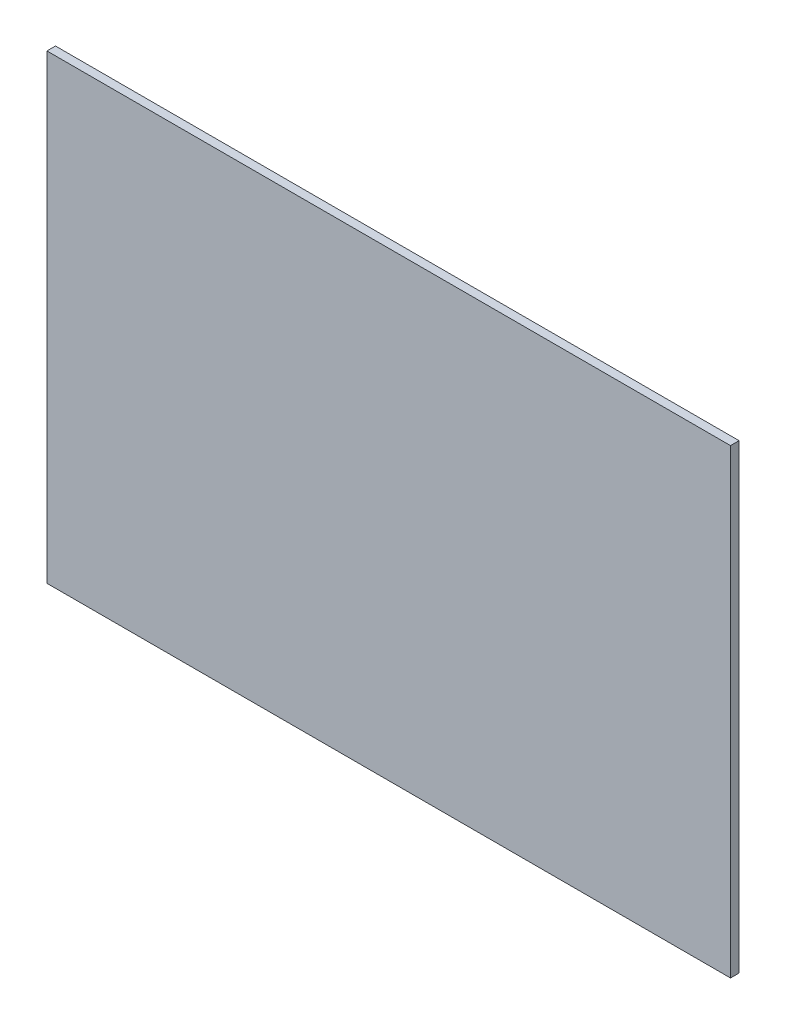
ISO-10303-21;
HEADER;
FILE_DESCRIPTION(('STEP AP214'),'2;1');
FILE_NAME('part.step','',(''),(''),'','','');
FILE_SCHEMA(('AUTOMOTIVE_DESIGN { 1 0 10303 214 1 1 1 1 }'));
ENDSEC;
DATA;
#1=APPLICATION_CONTEXT('core data for automotive mechanical design processes');
#2=APPLICATION_PROTOCOL_DEFINITION('international standard','automotive_design',2000,#1);
#3=PRODUCT_CONTEXT('',#1,'mechanical');
#4=PRODUCT('Part','Part','',(#3));
#5=PRODUCT_RELATED_PRODUCT_CATEGORY('part','',(#4));
#6=PRODUCT_DEFINITION_FORMATION('','',#4);
#7=PRODUCT_DEFINITION_CONTEXT('part definition',#1,'design');
#8=PRODUCT_DEFINITION('design','',#6,#7);
#9=PRODUCT_DEFINITION_SHAPE('','',#8);
#10=(LENGTH_UNIT() NAMED_UNIT(*) SI_UNIT(.MILLI.,.METRE.));
#11=(NAMED_UNIT(*) PLANE_ANGLE_UNIT() SI_UNIT($,.RADIAN.));
#12=(NAMED_UNIT(*) SI_UNIT($,.STERADIAN.) SOLID_ANGLE_UNIT());
#13=UNCERTAINTY_MEASURE_WITH_UNIT(LENGTH_MEASURE(1.E-05),#10,'distance_accuracy_value','');
#14=(GEOMETRIC_REPRESENTATION_CONTEXT(3) GLOBAL_UNCERTAINTY_ASSIGNED_CONTEXT((#13)) GLOBAL_UNIT_ASSIGNED_CONTEXT((#10,
#11,#12)) REPRESENTATION_CONTEXT('',''));
#15=CARTESIAN_POINT('',(0.,0.,0.));
#16=DIRECTION('',(0.,0.,1.));
#17=DIRECTION('',(1.,0.,0.));
#18=AXIS2_PLACEMENT_3D('',#15,#16,#17);
#19=CARTESIAN_POINT('',(460.816653826392,-310.816653826392,-988.461019240786));
#20=DIRECTION('',(0.,-1.,0.));
#21=DIRECTION('',(0.,0.,-1.));
#22=AXIS2_PLACEMENT_3D('',#19,#20,#21);
#23=PLANE('',#22);
#24=DIRECTION('',(-1.,0.,0.));
#25=VECTOR('',#24,1.);
#26=CARTESIAN_POINT('',(460.816653826392,-310.816653826392,-999.999));
#27=LINE('',#26,#25);
#28=CARTESIAN_POINT('',(460.816653826392,-310.816653826392,-999.999));
#29=VERTEX_POINT('',#28);
#30=CARTESIAN_POINT('',(-460.816653826392,-310.816653826392,-999.999));
#31=VERTEX_POINT('',#30);
#32=EDGE_CURVE('E79',#29,#31,#27,.T.);
#33=ORIENTED_EDGE('',*,*,#32,.F.);
#34=DIRECTION('',(0.,0.,-1.));
#35=VECTOR('',#34,1.);
#36=CARTESIAN_POINT('',(460.816653826392,-310.816653826392,-988.461019240786));
#37=LINE('',#36,#35);
#38=CARTESIAN_POINT('',(460.816653826392,-310.816653826392,-988.461019240786));
#39=VERTEX_POINT('',#38);
#40=EDGE_CURVE('E32',#39,#29,#37,.T.);
#41=ORIENTED_EDGE('',*,*,#40,.F.);
#42=DIRECTION('',(-1.,0.,0.));
#43=VECTOR('',#42,1.);
#44=CARTESIAN_POINT('',(460.816653826392,-310.816653826392,-988.461019240786));
#45=LINE('',#44,#43);
#46=CARTESIAN_POINT('',(-460.816653826392,-310.816653826392,-988.461019240786));
#47=VERTEX_POINT('',#46);
#48=EDGE_CURVE('E71',#39,#47,#45,.T.);
#49=ORIENTED_EDGE('',*,*,#48,.T.);
#50=DIRECTION('',(0.,0.,-1.));
#51=VECTOR('',#50,1.);
#52=CARTESIAN_POINT('',(-460.816653826392,-310.816653826392,-988.461019240786));
#53=LINE('',#52,#51);
#54=EDGE_CURVE('E10',#47,#31,#53,.T.);
#55=ORIENTED_EDGE('',*,*,#54,.T.);
#56=EDGE_LOOP('',(#33,#41,#49,#55));
#57=FACE_BOUND('',#56,.T.);
#58=ADVANCED_FACE('F16',(#57),#23,.T.);
#59=CARTESIAN_POINT('',(-460.816653826392,-310.816653826392,-988.461019240786));
#60=DIRECTION('',(-1.,0.,0.));
#61=DIRECTION('',(0.,-1.,0.));
#62=AXIS2_PLACEMENT_3D('',#59,#60,#61);
#63=PLANE('',#62);
#64=DIRECTION('',(0.,1.,0.));
#65=VECTOR('',#64,1.);
#66=CARTESIAN_POINT('',(-460.816653826392,-310.816653826392,-999.999));
#67=LINE('',#66,#65);
#68=CARTESIAN_POINT('',(-460.816653826392,310.816653826392,-999.999));
#69=VERTEX_POINT('',#68);
#70=EDGE_CURVE('E82',#31,#69,#67,.T.);
#71=ORIENTED_EDGE('',*,*,#70,.F.);
#72=ORIENTED_EDGE('',*,*,#54,.F.);
#73=DIRECTION('',(0.,1.,0.));
#74=VECTOR('',#73,1.);
#75=CARTESIAN_POINT('',(-460.816653826392,-310.816653826392,-988.461019240786));
#76=LINE('',#75,#74);
#77=CARTESIAN_POINT('',(-460.816653826392,310.816653826392,-988.461019240786));
#78=VERTEX_POINT('',#77);
#79=EDGE_CURVE('E67',#47,#78,#76,.T.);
#80=ORIENTED_EDGE('',*,*,#79,.T.);
#81=DIRECTION('',(0.,0.,-1.));
#82=VECTOR('',#81,1.);
#83=CARTESIAN_POINT('',(-460.816653826392,310.816653826392,-988.461019240786));
#84=LINE('',#83,#82);
#85=EDGE_CURVE('E24',#78,#69,#84,.T.);
#86=ORIENTED_EDGE('',*,*,#85,.T.);
#87=EDGE_LOOP('',(#71,#72,#80,#86));
#88=FACE_BOUND('',#87,.T.);
#89=ADVANCED_FACE('F68',(#88),#63,.T.);
#90=CARTESIAN_POINT('',(-460.816653826392,310.816653826392,-988.461019240786));
#91=DIRECTION('',(0.,1.,0.));
#92=DIRECTION('',(0.,0.,1.));
#93=AXIS2_PLACEMENT_3D('',#90,#91,#92);
#94=PLANE('',#93);
#95=DIRECTION('',(1.,0.,0.));
#96=VECTOR('',#95,1.);
#97=CARTESIAN_POINT('',(-460.816653826392,310.816653826392,-999.999));
#98=LINE('',#97,#96);
#99=CARTESIAN_POINT('',(460.816653826392,310.816653826392,-999.999));
#100=VERTEX_POINT('',#99);
#101=EDGE_CURVE('E65',#69,#100,#98,.T.);
#102=ORIENTED_EDGE('',*,*,#101,.F.);
#103=ORIENTED_EDGE('',*,*,#85,.F.);
#104=DIRECTION('',(1.,0.,0.));
#105=VECTOR('',#104,1.);
#106=CARTESIAN_POINT('',(-460.816653826392,310.816653826392,-988.461019240786));
#107=LINE('',#106,#105);
#108=CARTESIAN_POINT('',(460.816653826392,310.816653826392,-988.461019240786));
#109=VERTEX_POINT('',#108);
#110=EDGE_CURVE('E62',#78,#109,#107,.T.);
#111=ORIENTED_EDGE('',*,*,#110,.T.);
#112=DIRECTION('',(0.,0.,-1.));
#113=VECTOR('',#112,1.);
#114=CARTESIAN_POINT('',(460.816653826392,310.816653826392,-988.461019240786));
#115=LINE('',#114,#113);
#116=EDGE_CURVE('E48',#109,#100,#115,.T.);
#117=ORIENTED_EDGE('',*,*,#116,.T.);
#118=EDGE_LOOP('',(#102,#103,#111,#117));
#119=FACE_BOUND('',#118,.T.);
#120=ADVANCED_FACE('F60',(#119),#94,.T.);
#121=CARTESIAN_POINT('',(460.816653826392,310.816653826392,-988.461019240786));
#122=DIRECTION('',(1.,0.,0.));
#123=DIRECTION('',(0.,1.,0.));
#124=AXIS2_PLACEMENT_3D('',#121,#122,#123);
#125=PLANE('',#124);
#126=DIRECTION('',(0.,-1.,0.));
#127=VECTOR('',#126,1.);
#128=CARTESIAN_POINT('',(460.816653826392,310.816653826392,-999.999));
#129=LINE('',#128,#127);
#130=EDGE_CURVE('E85',#100,#29,#129,.T.);
#131=ORIENTED_EDGE('',*,*,#130,.F.);
#132=ORIENTED_EDGE('',*,*,#116,.F.);
#133=DIRECTION('',(0.,-1.,0.));
#134=VECTOR('',#133,1.);
#135=CARTESIAN_POINT('',(460.816653826392,310.816653826392,-988.461019240786));
#136=LINE('',#135,#134);
#137=EDGE_CURVE('E74',#109,#39,#136,.T.);
#138=ORIENTED_EDGE('',*,*,#137,.T.);
#139=ORIENTED_EDGE('',*,*,#40,.T.);
#140=EDGE_LOOP('',(#131,#132,#138,#139));
#141=FACE_BOUND('',#140,.T.);
#142=ADVANCED_FACE('F96',(#141),#125,.T.);
#143=CARTESIAN_POINT('',(-1.66533453693773E-13,-300.,-988.461019240786));
#144=DIRECTION('',(0.,0.,-1.));
#145=DIRECTION('',(0.,1.,0.));
#146=AXIS2_PLACEMENT_3D('',#143,#144,#145);
#147=PLANE('',#146);
#148=ORIENTED_EDGE('',*,*,#48,.F.);
#149=ORIENTED_EDGE('',*,*,#137,.F.);
#150=ORIENTED_EDGE('',*,*,#110,.F.);
#151=ORIENTED_EDGE('',*,*,#79,.F.);
#152=EDGE_LOOP('',(#148,#149,#150,#151));
#153=FACE_BOUND('',#152,.T.);
#154=ADVANCED_FACE('F73',(#153),#147,.F.);
#155=CARTESIAN_POINT('',(-1.66533453693773E-13,-300.,-999.999));
#156=DIRECTION('',(0.,0.,-1.));
#157=DIRECTION('',(0.,1.,0.));
#158=AXIS2_PLACEMENT_3D('',#155,#156,#157);
#159=PLANE('',#158);
#160=ORIENTED_EDGE('',*,*,#32,.T.);
#161=ORIENTED_EDGE('',*,*,#70,.T.);
#162=ORIENTED_EDGE('',*,*,#101,.T.);
#163=ORIENTED_EDGE('',*,*,#130,.T.);
#164=EDGE_LOOP('',(#160,#161,#162,#163));
#165=FACE_BOUND('',#164,.T.);
#166=ADVANCED_FACE('F89',(#165),#159,.T.);
#167=CLOSED_SHELL('',(#58,#89,#120,#142,#154,#166));
#168=MANIFOLD_SOLID_BREP('B1',#167);
#169=ADVANCED_BREP_SHAPE_REPRESENTATION('',(#18,#168),#14);
#170=SHAPE_DEFINITION_REPRESENTATION(#9,#169);
ENDSEC;
END-ISO-10303-21;
